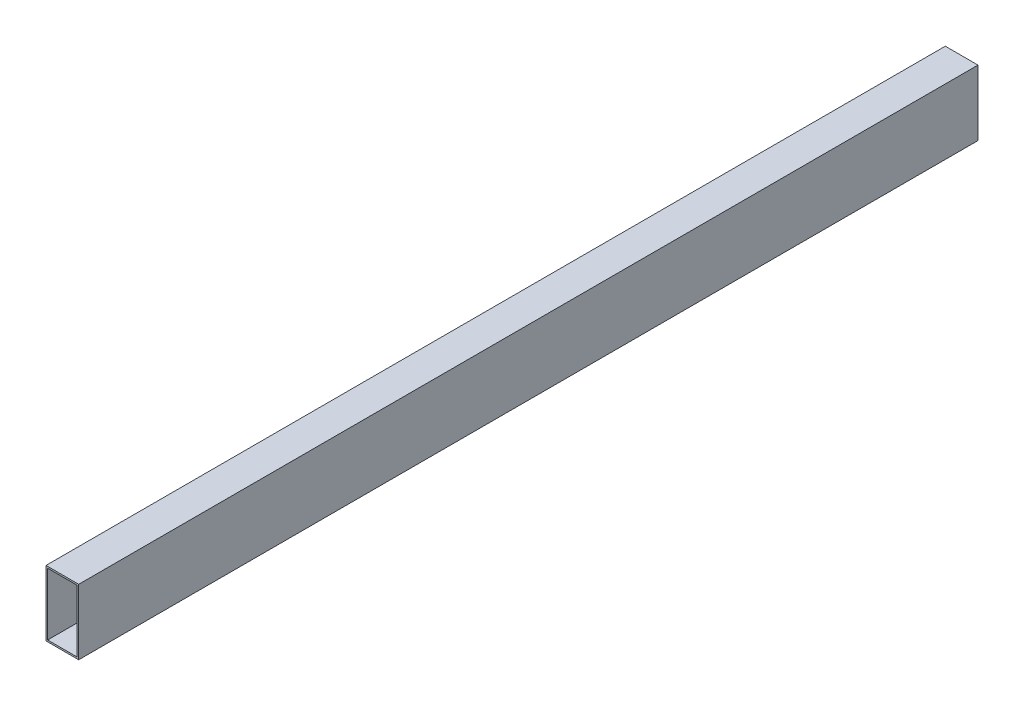
ISO-10303-21;
HEADER;
FILE_DESCRIPTION(('STEP AP214'),'2;1');
FILE_NAME('part.step','',(''),(''),'','','');
FILE_SCHEMA(('AUTOMOTIVE_DESIGN { 1 0 10303 214 1 1 1 1 }'));
ENDSEC;
DATA;
#1=APPLICATION_CONTEXT('core data for automotive mechanical design processes');
#2=APPLICATION_PROTOCOL_DEFINITION('international standard','automotive_design',2000,#1);
#3=PRODUCT_CONTEXT('',#1,'mechanical');
#4=PRODUCT('Part','Part','',(#3));
#5=PRODUCT_RELATED_PRODUCT_CATEGORY('part','',(#4));
#6=PRODUCT_DEFINITION_FORMATION('','',#4);
#7=PRODUCT_DEFINITION_CONTEXT('part definition',#1,'design');
#8=PRODUCT_DEFINITION('design','',#6,#7);
#9=PRODUCT_DEFINITION_SHAPE('','',#8);
#10=(LENGTH_UNIT() NAMED_UNIT(*) SI_UNIT(.MILLI.,.METRE.));
#11=(NAMED_UNIT(*) PLANE_ANGLE_UNIT() SI_UNIT($,.RADIAN.));
#12=(NAMED_UNIT(*) SI_UNIT($,.STERADIAN.) SOLID_ANGLE_UNIT());
#13=UNCERTAINTY_MEASURE_WITH_UNIT(LENGTH_MEASURE(1.E-05),#10,'distance_accuracy_value','');
#14=(GEOMETRIC_REPRESENTATION_CONTEXT(3) GLOBAL_UNCERTAINTY_ASSIGNED_CONTEXT((#13)) GLOBAL_UNIT_ASSIGNED_CONTEXT((#10,
#11,#12)) REPRESENTATION_CONTEXT('',''));
#15=CARTESIAN_POINT('',(0.,0.,0.));
#16=DIRECTION('',(0.,0.,1.));
#17=DIRECTION('',(1.,0.,0.));
#18=AXIS2_PLACEMENT_3D('',#15,#16,#17);
#19=CARTESIAN_POINT('',(0.,0.,550.));
#20=DIRECTION('',(0.,0.,1.));
#21=DIRECTION('',(1.,0.,0.));
#22=AXIS2_PLACEMENT_3D('',#19,#20,#21);
#23=PLANE('',#22);
#24=DIRECTION('',(0.,-1.,0.));
#25=VECTOR('',#24,1.);
#26=CARTESIAN_POINT('',(0.,0.,550.));
#27=LINE('',#26,#25);
#28=CARTESIAN_POINT('',(0.,0.,550.));
#29=VERTEX_POINT('',#28);
#30=CARTESIAN_POINT('',(0.,-40.,550.));
#31=VERTEX_POINT('',#30);
#32=EDGE_CURVE('E166',#29,#31,#27,.T.);
#33=ORIENTED_EDGE('',*,*,#32,.T.);
#34=DIRECTION('',(1.,0.,0.));
#35=VECTOR('',#34,1.);
#36=CARTESIAN_POINT('',(0.,-40.,550.));
#37=LINE('',#36,#35);
#38=CARTESIAN_POINT('',(20.,-40.,550.));
#39=VERTEX_POINT('',#38);
#40=EDGE_CURVE('E169',#31,#39,#37,.T.);
#41=ORIENTED_EDGE('',*,*,#40,.T.);
#42=DIRECTION('',(0.,1.,0.));
#43=VECTOR('',#42,1.);
#44=CARTESIAN_POINT('',(20.,0.,550.));
#45=LINE('',#44,#43);
#46=CARTESIAN_POINT('',(20.,0.,550.));
#47=VERTEX_POINT('',#46);
#48=EDGE_CURVE('E172',#39,#47,#45,.T.);
#49=ORIENTED_EDGE('',*,*,#48,.T.);
#50=DIRECTION('',(-1.,0.,0.));
#51=VECTOR('',#50,1.);
#52=CARTESIAN_POINT('',(0.,0.,550.));
#53=LINE('',#52,#51);
#54=EDGE_CURVE('E174',#47,#29,#53,.T.);
#55=ORIENTED_EDGE('',*,*,#54,.T.);
#56=EDGE_LOOP('',(#33,#41,#49,#55));
#57=FACE_BOUND('',#56,.T.);
#58=DIRECTION('',(1.,0.,0.));
#59=VECTOR('',#58,1.);
#60=CARTESIAN_POINT('',(0.,-39.,550.));
#61=LINE('',#60,#59);
#62=CARTESIAN_POINT('',(1.,-39.,550.));
#63=VERTEX_POINT('',#62);
#64=CARTESIAN_POINT('',(19.,-39.,550.));
#65=VERTEX_POINT('',#64);
#66=EDGE_CURVE('E138',#63,#65,#61,.T.);
#67=ORIENTED_EDGE('',*,*,#66,.F.);
#68=DIRECTION('',(0.,-1.,0.));
#69=VECTOR('',#68,1.);
#70=CARTESIAN_POINT('',(1.,0.,550.));
#71=LINE('',#70,#69);
#72=CARTESIAN_POINT('',(1.,-1.,550.));
#73=VERTEX_POINT('',#72);
#74=EDGE_CURVE('E130',#73,#63,#71,.T.);
#75=ORIENTED_EDGE('',*,*,#74,.F.);
#76=DIRECTION('',(-1.,0.,0.));
#77=VECTOR('',#76,1.);
#78=CARTESIAN_POINT('',(0.,-1.,550.));
#79=LINE('',#78,#77);
#80=CARTESIAN_POINT('',(19.,-1.,550.));
#81=VERTEX_POINT('',#80);
#82=EDGE_CURVE('E152',#81,#73,#79,.T.);
#83=ORIENTED_EDGE('',*,*,#82,.F.);
#84=DIRECTION('',(0.,1.,0.));
#85=VECTOR('',#84,1.);
#86=CARTESIAN_POINT('',(19.,0.,550.));
#87=LINE('',#86,#85);
#88=EDGE_CURVE('E150',#65,#81,#87,.T.);
#89=ORIENTED_EDGE('',*,*,#88,.F.);
#90=EDGE_LOOP('',(#67,#75,#83,#89));
#91=FACE_BOUND('',#90,.T.);
#92=ADVANCED_FACE('F65',(#57,#91),#23,.T.);
#93=CARTESIAN_POINT('',(0.,0.,0.));
#94=DIRECTION('',(0.,0.,1.));
#95=DIRECTION('',(1.,0.,0.));
#96=AXIS2_PLACEMENT_3D('',#93,#94,#95);
#97=PLANE('',#96);
#98=DIRECTION('',(0.,-1.,0.));
#99=VECTOR('',#98,1.);
#100=CARTESIAN_POINT('',(0.,0.,0.));
#101=LINE('',#100,#99);
#102=CARTESIAN_POINT('',(0.,0.,0.));
#103=VERTEX_POINT('',#102);
#104=CARTESIAN_POINT('',(0.,-40.,0.));
#105=VERTEX_POINT('',#104);
#106=EDGE_CURVE('E146',#103,#105,#101,.T.);
#107=ORIENTED_EDGE('',*,*,#106,.F.);
#108=DIRECTION('',(-1.,0.,0.));
#109=VECTOR('',#108,1.);
#110=CARTESIAN_POINT('',(0.,0.,0.));
#111=LINE('',#110,#109);
#112=CARTESIAN_POINT('',(20.,0.,0.));
#113=VERTEX_POINT('',#112);
#114=EDGE_CURVE('E170',#113,#103,#111,.T.);
#115=ORIENTED_EDGE('',*,*,#114,.F.);
#116=DIRECTION('',(0.,1.,0.));
#117=VECTOR('',#116,1.);
#118=CARTESIAN_POINT('',(20.,0.,0.));
#119=LINE('',#118,#117);
#120=CARTESIAN_POINT('',(20.,-40.,0.));
#121=VERTEX_POINT('',#120);
#122=EDGE_CURVE('E181',#121,#113,#119,.T.);
#123=ORIENTED_EDGE('',*,*,#122,.F.);
#124=DIRECTION('',(1.,0.,0.));
#125=VECTOR('',#124,1.);
#126=CARTESIAN_POINT('',(0.,-40.,0.));
#127=LINE('',#126,#125);
#128=EDGE_CURVE('E179',#105,#121,#127,.T.);
#129=ORIENTED_EDGE('',*,*,#128,.F.);
#130=EDGE_LOOP('',(#107,#115,#123,#129));
#131=FACE_BOUND('',#130,.T.);
#132=DIRECTION('',(0.,-1.,0.));
#133=VECTOR('',#132,1.);
#134=CARTESIAN_POINT('',(1.,0.,0.));
#135=LINE('',#134,#133);
#136=CARTESIAN_POINT('',(1.,-1.,0.));
#137=VERTEX_POINT('',#136);
#138=CARTESIAN_POINT('',(1.,-39.,0.));
#139=VERTEX_POINT('',#138);
#140=EDGE_CURVE('E88',#137,#139,#135,.T.);
#141=ORIENTED_EDGE('',*,*,#140,.T.);
#142=DIRECTION('',(1.,0.,0.));
#143=VECTOR('',#142,1.);
#144=CARTESIAN_POINT('',(0.,-39.,0.));
#145=LINE('',#144,#143);
#146=CARTESIAN_POINT('',(19.,-39.,0.));
#147=VERTEX_POINT('',#146);
#148=EDGE_CURVE('E145',#139,#147,#145,.T.);
#149=ORIENTED_EDGE('',*,*,#148,.T.);
#150=DIRECTION('',(0.,1.,0.));
#151=VECTOR('',#150,1.);
#152=CARTESIAN_POINT('',(19.,0.,0.));
#153=LINE('',#152,#151);
#154=CARTESIAN_POINT('',(19.,-1.,0.));
#155=VERTEX_POINT('',#154);
#156=EDGE_CURVE('E158',#147,#155,#153,.T.);
#157=ORIENTED_EDGE('',*,*,#156,.T.);
#158=DIRECTION('',(-1.,0.,0.));
#159=VECTOR('',#158,1.);
#160=CARTESIAN_POINT('',(0.,-1.,0.));
#161=LINE('',#160,#159);
#162=EDGE_CURVE('E139',#155,#137,#161,.T.);
#163=ORIENTED_EDGE('',*,*,#162,.T.);
#164=EDGE_LOOP('',(#141,#149,#157,#163));
#165=FACE_BOUND('',#164,.T.);
#166=ADVANCED_FACE('F199',(#131,#165),#97,.F.);
#167=CARTESIAN_POINT('',(0.,0.,550.));
#168=DIRECTION('',(1.,0.,0.));
#169=DIRECTION('',(0.,1.,0.));
#170=AXIS2_PLACEMENT_3D('',#167,#168,#169);
#171=PLANE('',#170);
#172=ORIENTED_EDGE('',*,*,#106,.T.);
#173=DIRECTION('',(0.,0.,-1.));
#174=VECTOR('',#173,1.);
#175=CARTESIAN_POINT('',(0.,-40.,550.));
#176=LINE('',#175,#174);
#177=EDGE_CURVE('E12',#31,#105,#176,.T.);
#178=ORIENTED_EDGE('',*,*,#177,.F.);
#179=ORIENTED_EDGE('',*,*,#32,.F.);
#180=DIRECTION('',(0.,0.,-1.));
#181=VECTOR('',#180,1.);
#182=CARTESIAN_POINT('',(0.,0.,550.));
#183=LINE('',#182,#181);
#184=EDGE_CURVE('E176',#29,#103,#183,.T.);
#185=ORIENTED_EDGE('',*,*,#184,.T.);
#186=EDGE_LOOP('',(#172,#178,#179,#185));
#187=FACE_BOUND('',#186,.T.);
#188=ADVANCED_FACE('F67',(#187),#171,.F.);
#189=CARTESIAN_POINT('',(0.,-40.,550.));
#190=DIRECTION('',(0.,1.,0.));
#191=DIRECTION('',(0.,0.,1.));
#192=AXIS2_PLACEMENT_3D('',#189,#190,#191);
#193=PLANE('',#192);
#194=ORIENTED_EDGE('',*,*,#128,.T.);
#195=DIRECTION('',(0.,0.,-1.));
#196=VECTOR('',#195,1.);
#197=CARTESIAN_POINT('',(20.,-40.,550.));
#198=LINE('',#197,#196);
#199=EDGE_CURVE('E73',#39,#121,#198,.T.);
#200=ORIENTED_EDGE('',*,*,#199,.F.);
#201=ORIENTED_EDGE('',*,*,#40,.F.);
#202=ORIENTED_EDGE('',*,*,#177,.T.);
#203=EDGE_LOOP('',(#194,#200,#201,#202));
#204=FACE_BOUND('',#203,.T.);
#205=ADVANCED_FACE('F209',(#204),#193,.F.);
#206=CARTESIAN_POINT('',(20.,0.,550.));
#207=DIRECTION('',(-1.,0.,0.));
#208=DIRECTION('',(0.,-1.,0.));
#209=AXIS2_PLACEMENT_3D('',#206,#207,#208);
#210=PLANE('',#209);
#211=ORIENTED_EDGE('',*,*,#122,.T.);
#212=DIRECTION('',(0.,0.,-1.));
#213=VECTOR('',#212,1.);
#214=CARTESIAN_POINT('',(20.,0.,550.));
#215=LINE('',#214,#213);
#216=EDGE_CURVE('E186',#47,#113,#215,.T.);
#217=ORIENTED_EDGE('',*,*,#216,.F.);
#218=ORIENTED_EDGE('',*,*,#48,.F.);
#219=ORIENTED_EDGE('',*,*,#199,.T.);
#220=EDGE_LOOP('',(#211,#217,#218,#219));
#221=FACE_BOUND('',#220,.T.);
#222=ADVANCED_FACE('F193',(#221),#210,.F.);
#223=CARTESIAN_POINT('',(0.,0.,550.));
#224=DIRECTION('',(0.,-1.,0.));
#225=DIRECTION('',(0.,0.,-1.));
#226=AXIS2_PLACEMENT_3D('',#223,#224,#225);
#227=PLANE('',#226);
#228=ORIENTED_EDGE('',*,*,#114,.T.);
#229=ORIENTED_EDGE('',*,*,#184,.F.);
#230=ORIENTED_EDGE('',*,*,#54,.F.);
#231=ORIENTED_EDGE('',*,*,#216,.T.);
#232=EDGE_LOOP('',(#228,#229,#230,#231));
#233=FACE_BOUND('',#232,.T.);
#234=ADVANCED_FACE('F203',(#233),#227,.F.);
#235=CARTESIAN_POINT('',(1.,0.,550.));
#236=DIRECTION('',(1.,0.,0.));
#237=DIRECTION('',(0.,1.,0.));
#238=AXIS2_PLACEMENT_3D('',#235,#236,#237);
#239=PLANE('',#238);
#240=ORIENTED_EDGE('',*,*,#140,.F.);
#241=DIRECTION('',(0.,0.,-1.));
#242=VECTOR('',#241,1.);
#243=CARTESIAN_POINT('',(1.,-1.,550.));
#244=LINE('',#243,#242);
#245=EDGE_CURVE('E134',#73,#137,#244,.T.);
#246=ORIENTED_EDGE('',*,*,#245,.F.);
#247=ORIENTED_EDGE('',*,*,#74,.T.);
#248=DIRECTION('',(0.,0.,-1.));
#249=VECTOR('',#248,1.);
#250=CARTESIAN_POINT('',(1.,-39.,550.));
#251=LINE('',#250,#249);
#252=EDGE_CURVE('E133',#63,#139,#251,.T.);
#253=ORIENTED_EDGE('',*,*,#252,.T.);
#254=EDGE_LOOP('',(#240,#246,#247,#253));
#255=FACE_BOUND('',#254,.T.);
#256=ADVANCED_FACE('F132',(#255),#239,.T.);
#257=CARTESIAN_POINT('',(0.,-39.,550.));
#258=DIRECTION('',(0.,1.,0.));
#259=DIRECTION('',(0.,0.,1.));
#260=AXIS2_PLACEMENT_3D('',#257,#258,#259);
#261=PLANE('',#260);
#262=ORIENTED_EDGE('',*,*,#148,.F.);
#263=ORIENTED_EDGE('',*,*,#252,.F.);
#264=ORIENTED_EDGE('',*,*,#66,.T.);
#265=DIRECTION('',(0.,0.,-1.));
#266=VECTOR('',#265,1.);
#267=CARTESIAN_POINT('',(19.,-39.,550.));
#268=LINE('',#267,#266);
#269=EDGE_CURVE('E147',#65,#147,#268,.T.);
#270=ORIENTED_EDGE('',*,*,#269,.T.);
#271=EDGE_LOOP('',(#262,#263,#264,#270));
#272=FACE_BOUND('',#271,.T.);
#273=ADVANCED_FACE('F142',(#272),#261,.T.);
#274=CARTESIAN_POINT('',(19.,0.,550.));
#275=DIRECTION('',(-1.,0.,0.));
#276=DIRECTION('',(0.,-1.,0.));
#277=AXIS2_PLACEMENT_3D('',#274,#275,#276);
#278=PLANE('',#277);
#279=ORIENTED_EDGE('',*,*,#156,.F.);
#280=ORIENTED_EDGE('',*,*,#269,.F.);
#281=ORIENTED_EDGE('',*,*,#88,.T.);
#282=DIRECTION('',(0.,0.,-1.));
#283=VECTOR('',#282,1.);
#284=CARTESIAN_POINT('',(19.,-1.,550.));
#285=LINE('',#284,#283);
#286=EDGE_CURVE('E80',#81,#155,#285,.T.);
#287=ORIENTED_EDGE('',*,*,#286,.T.);
#288=EDGE_LOOP('',(#279,#280,#281,#287));
#289=FACE_BOUND('',#288,.T.);
#290=ADVANCED_FACE('F232',(#289),#278,.T.);
#291=CARTESIAN_POINT('',(0.,-1.,550.));
#292=DIRECTION('',(0.,-1.,0.));
#293=DIRECTION('',(0.,0.,-1.));
#294=AXIS2_PLACEMENT_3D('',#291,#292,#293);
#295=PLANE('',#294);
#296=ORIENTED_EDGE('',*,*,#162,.F.);
#297=ORIENTED_EDGE('',*,*,#286,.F.);
#298=ORIENTED_EDGE('',*,*,#82,.T.);
#299=ORIENTED_EDGE('',*,*,#245,.T.);
#300=EDGE_LOOP('',(#296,#297,#298,#299));
#301=FACE_BOUND('',#300,.T.);
#302=ADVANCED_FACE('F236',(#301),#295,.T.);
#303=CLOSED_SHELL('',(#92,#166,#188,#205,#222,#234,#256,#273,#290,#302));
#304=MANIFOLD_SOLID_BREP('B2',#303);
#305=ADVANCED_BREP_SHAPE_REPRESENTATION('',(#18,#304),#14);
#306=SHAPE_DEFINITION_REPRESENTATION(#9,#305);
ENDSEC;
END-ISO-10303-21;
